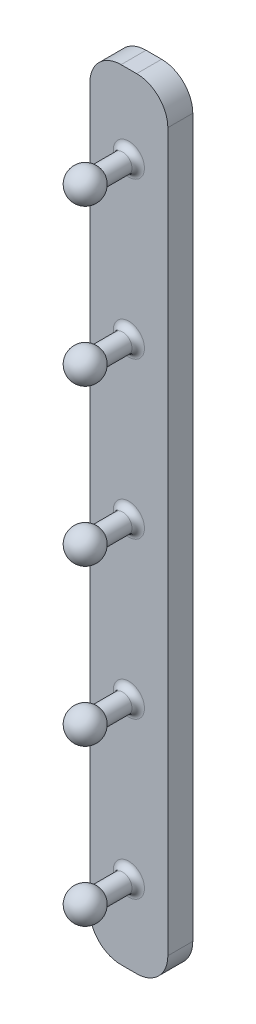
ISO-10303-21;
HEADER;
FILE_DESCRIPTION(('STEP AP214'),'2;1');
FILE_NAME('part.step','',(''),(''),'','','');
FILE_SCHEMA(('AUTOMOTIVE_DESIGN { 1 0 10303 214 1 1 1 1 }'));
ENDSEC;
DATA;
#1=APPLICATION_CONTEXT('core data for automotive mechanical design processes');
#2=APPLICATION_PROTOCOL_DEFINITION('international standard','automotive_design',2000,#1);
#3=PRODUCT_CONTEXT('',#1,'mechanical');
#4=PRODUCT('Part','Part','',(#3));
#5=PRODUCT_RELATED_PRODUCT_CATEGORY('part','',(#4));
#6=PRODUCT_DEFINITION_FORMATION('','',#4);
#7=PRODUCT_DEFINITION_CONTEXT('part definition',#1,'design');
#8=PRODUCT_DEFINITION('design','',#6,#7);
#9=PRODUCT_DEFINITION_SHAPE('','',#8);
#10=(LENGTH_UNIT() NAMED_UNIT(*) SI_UNIT(.MILLI.,.METRE.));
#11=(NAMED_UNIT(*) PLANE_ANGLE_UNIT() SI_UNIT($,.RADIAN.));
#12=(NAMED_UNIT(*) SI_UNIT($,.STERADIAN.) SOLID_ANGLE_UNIT());
#13=UNCERTAINTY_MEASURE_WITH_UNIT(LENGTH_MEASURE(1.E-05),#10,'distance_accuracy_value','');
#14=(GEOMETRIC_REPRESENTATION_CONTEXT(3) GLOBAL_UNCERTAINTY_ASSIGNED_CONTEXT((#13)) GLOBAL_UNIT_ASSIGNED_CONTEXT((#10,
#11,#12)) REPRESENTATION_CONTEXT('',''));
#15=CARTESIAN_POINT('',(0.,0.,0.));
#16=DIRECTION('',(0.,0.,1.));
#17=DIRECTION('',(1.,0.,0.));
#18=AXIS2_PLACEMENT_3D('',#15,#16,#17);
#19=CARTESIAN_POINT('',(2.5,-115.,8.));
#20=DIRECTION('',(0.,0.,-1.));
#21=DIRECTION('',(-1.,0.,0.));
#22=AXIS2_PLACEMENT_3D('',#19,#20,#21);
#23=CYLINDRICAL_SURFACE('',#22,10.);
#24=CARTESIAN_POINT('',(2.5,-115.,0.));
#25=DIRECTION('',(0.,0.,1.));
#26=DIRECTION('',(1.,0.,0.));
#27=AXIS2_PLACEMENT_3D('',#24,#25,#26);
#28=CIRCLE('',#27,10.);
#29=CARTESIAN_POINT('',(2.5,-125.,0.));
#30=VERTEX_POINT('',#29);
#31=CARTESIAN_POINT('',(12.5,-115.,0.));
#32=VERTEX_POINT('',#31);
#33=EDGE_CURVE('E139',#30,#32,#28,.T.);
#34=ORIENTED_EDGE('',*,*,#33,.T.);
#35=DIRECTION('',(0.,0.,-1.));
#36=VECTOR('',#35,1.);
#37=CARTESIAN_POINT('',(12.5,-115.,8.));
#38=LINE('',#37,#36);
#39=CARTESIAN_POINT('',(12.5,-115.,8.));
#40=VERTEX_POINT('',#39);
#41=EDGE_CURVE('E167',#40,#32,#38,.T.);
#42=ORIENTED_EDGE('',*,*,#41,.F.);
#43=CARTESIAN_POINT('',(2.5,-115.,8.));
#44=DIRECTION('',(0.,0.,1.));
#45=DIRECTION('',(1.,0.,0.));
#46=AXIS2_PLACEMENT_3D('',#43,#44,#45);
#47=CIRCLE('',#46,10.);
#48=CARTESIAN_POINT('',(2.5,-125.,8.));
#49=VERTEX_POINT('',#48);
#50=EDGE_CURVE('E154',#49,#40,#47,.T.);
#51=ORIENTED_EDGE('',*,*,#50,.F.);
#52=DIRECTION('',(0.,0.,-1.));
#53=VECTOR('',#52,1.);
#54=CARTESIAN_POINT('',(2.5,-125.,8.));
#55=LINE('',#54,#53);
#56=EDGE_CURVE('E135',#49,#30,#55,.T.);
#57=ORIENTED_EDGE('',*,*,#56,.T.);
#58=EDGE_LOOP('',(#34,#42,#51,#57));
#59=FACE_BOUND('',#58,.T.);
#60=ADVANCED_FACE('F41',(#59),#23,.T.);
#61=CARTESIAN_POINT('',(12.5,-115.,8.));
#62=DIRECTION('',(-1.,0.,0.));
#63=DIRECTION('',(0.,-1.,0.));
#64=AXIS2_PLACEMENT_3D('',#61,#62,#63);
#65=PLANE('',#64);
#66=DIRECTION('',(0.,1.,0.));
#67=VECTOR('',#66,1.);
#68=CARTESIAN_POINT('',(12.5,-115.,0.));
#69=LINE('',#68,#67);
#70=CARTESIAN_POINT('',(12.5,115.,0.));
#71=VERTEX_POINT('',#70);
#72=EDGE_CURVE('E142',#32,#71,#69,.T.);
#73=ORIENTED_EDGE('',*,*,#72,.T.);
#74=DIRECTION('',(0.,0.,-1.));
#75=VECTOR('',#74,1.);
#76=CARTESIAN_POINT('',(12.5,115.,8.));
#77=LINE('',#76,#75);
#78=CARTESIAN_POINT('',(12.5,115.,8.));
#79=VERTEX_POINT('',#78);
#80=EDGE_CURVE('E164',#79,#71,#77,.T.);
#81=ORIENTED_EDGE('',*,*,#80,.F.);
#82=DIRECTION('',(0.,1.,0.));
#83=VECTOR('',#82,1.);
#84=CARTESIAN_POINT('',(12.5,-115.,8.));
#85=LINE('',#84,#83);
#86=EDGE_CURVE('E102',#40,#79,#85,.T.);
#87=ORIENTED_EDGE('',*,*,#86,.F.);
#88=ORIENTED_EDGE('',*,*,#41,.T.);
#89=EDGE_LOOP('',(#73,#81,#87,#88));
#90=FACE_BOUND('',#89,.T.);
#91=ADVANCED_FACE('F208',(#90),#65,.F.);
#92=CARTESIAN_POINT('',(2.5,115.,8.));
#93=DIRECTION('',(0.,0.,-1.));
#94=DIRECTION('',(-1.,0.,0.));
#95=AXIS2_PLACEMENT_3D('',#92,#93,#94);
#96=CYLINDRICAL_SURFACE('',#95,9.99999999999998);
#97=CARTESIAN_POINT('',(2.5,115.,0.));
#98=DIRECTION('',(0.,0.,1.));
#99=DIRECTION('',(1.,0.,0.));
#100=AXIS2_PLACEMENT_3D('',#97,#98,#99);
#101=CIRCLE('',#100,9.99999999999998);
#102=CARTESIAN_POINT('',(2.5,125.,0.));
#103=VERTEX_POINT('',#102);
#104=EDGE_CURVE('E145',#71,#103,#101,.T.);
#105=ORIENTED_EDGE('',*,*,#104,.T.);
#106=DIRECTION('',(0.,0.,-1.));
#107=VECTOR('',#106,1.);
#108=CARTESIAN_POINT('',(2.5,125.,8.));
#109=LINE('',#108,#107);
#110=CARTESIAN_POINT('',(2.5,125.,8.));
#111=VERTEX_POINT('',#110);
#112=EDGE_CURVE('E161',#111,#103,#109,.T.);
#113=ORIENTED_EDGE('',*,*,#112,.F.);
#114=CARTESIAN_POINT('',(2.5,115.,8.));
#115=DIRECTION('',(0.,0.,1.));
#116=DIRECTION('',(1.,0.,0.));
#117=AXIS2_PLACEMENT_3D('',#114,#115,#116);
#118=CIRCLE('',#117,9.99999999999998);
#119=EDGE_CURVE('E261',#79,#111,#118,.T.);
#120=ORIENTED_EDGE('',*,*,#119,.F.);
#121=ORIENTED_EDGE('',*,*,#80,.T.);
#122=EDGE_LOOP('',(#105,#113,#120,#121));
#123=FACE_BOUND('',#122,.T.);
#124=ADVANCED_FACE('F214',(#123),#96,.T.);
#125=CARTESIAN_POINT('',(-2.50000000000001,125.,8.));
#126=DIRECTION('',(0.,-1.,0.));
#127=DIRECTION('',(0.,0.,-1.));
#128=AXIS2_PLACEMENT_3D('',#125,#126,#127);
#129=PLANE('',#128);
#130=DIRECTION('',(-1.,0.,0.));
#131=VECTOR('',#130,1.);
#132=CARTESIAN_POINT('',(-2.50000000000001,125.,0.));
#133=LINE('',#132,#131);
#134=CARTESIAN_POINT('',(-2.5,125.,0.));
#135=VERTEX_POINT('',#134);
#136=EDGE_CURVE('E147',#103,#135,#133,.T.);
#137=ORIENTED_EDGE('',*,*,#136,.T.);
#138=DIRECTION('',(0.,0.,-1.));
#139=VECTOR('',#138,1.);
#140=CARTESIAN_POINT('',(-2.5,125.,8.));
#141=LINE('',#140,#139);
#142=CARTESIAN_POINT('',(-2.5,125.,8.));
#143=VERTEX_POINT('',#142);
#144=EDGE_CURVE('E158',#143,#135,#141,.T.);
#145=ORIENTED_EDGE('',*,*,#144,.F.);
#146=DIRECTION('',(-1.,0.,0.));
#147=VECTOR('',#146,1.);
#148=CARTESIAN_POINT('',(-2.50000000000001,125.,8.));
#149=LINE('',#148,#147);
#150=EDGE_CURVE('E263',#111,#143,#149,.T.);
#151=ORIENTED_EDGE('',*,*,#150,.F.);
#152=ORIENTED_EDGE('',*,*,#112,.T.);
#153=EDGE_LOOP('',(#137,#145,#151,#152));
#154=FACE_BOUND('',#153,.T.);
#155=ADVANCED_FACE('F269',(#154),#129,.F.);
#156=CARTESIAN_POINT('',(-2.5,115.,8.));
#157=DIRECTION('',(0.,0.,-1.));
#158=DIRECTION('',(-1.,0.,0.));
#159=AXIS2_PLACEMENT_3D('',#156,#157,#158);
#160=CYLINDRICAL_SURFACE('',#159,9.99999999999998);
#161=CARTESIAN_POINT('',(-2.5,115.,0.));
#162=DIRECTION('',(0.,0.,1.));
#163=DIRECTION('',(-1.,0.,0.));
#164=AXIS2_PLACEMENT_3D('',#161,#162,#163);
#165=CIRCLE('',#164,9.99999999999998);
#166=CARTESIAN_POINT('',(-12.5,115.,0.));
#167=VERTEX_POINT('',#166);
#168=EDGE_CURVE('E149',#135,#167,#165,.T.);
#169=ORIENTED_EDGE('',*,*,#168,.T.);
#170=DIRECTION('',(0.,0.,-1.));
#171=VECTOR('',#170,1.);
#172=CARTESIAN_POINT('',(-12.5,115.,8.));
#173=LINE('',#172,#171);
#174=CARTESIAN_POINT('',(-12.5,115.,8.));
#175=VERTEX_POINT('',#174);
#176=EDGE_CURVE('E130',#175,#167,#173,.T.);
#177=ORIENTED_EDGE('',*,*,#176,.F.);
#178=CARTESIAN_POINT('',(-2.5,115.,8.));
#179=DIRECTION('',(0.,0.,1.));
#180=DIRECTION('',(-1.,0.,0.));
#181=AXIS2_PLACEMENT_3D('',#178,#179,#180);
#182=CIRCLE('',#181,9.99999999999998);
#183=EDGE_CURVE('E121',#143,#175,#182,.T.);
#184=ORIENTED_EDGE('',*,*,#183,.F.);
#185=ORIENTED_EDGE('',*,*,#144,.T.);
#186=EDGE_LOOP('',(#169,#177,#184,#185));
#187=FACE_BOUND('',#186,.T.);
#188=ADVANCED_FACE('F273',(#187),#160,.T.);
#189=CARTESIAN_POINT('',(-12.5,-115.,8.));
#190=DIRECTION('',(1.,0.,0.));
#191=DIRECTION('',(0.,1.,0.));
#192=AXIS2_PLACEMENT_3D('',#189,#190,#191);
#193=PLANE('',#192);
#194=DIRECTION('',(0.,-1.,0.));
#195=VECTOR('',#194,1.);
#196=CARTESIAN_POINT('',(-12.5,-115.,0.));
#197=LINE('',#196,#195);
#198=CARTESIAN_POINT('',(-12.5,-115.,0.));
#199=VERTEX_POINT('',#198);
#200=EDGE_CURVE('E129',#167,#199,#197,.T.);
#201=ORIENTED_EDGE('',*,*,#200,.T.);
#202=DIRECTION('',(0.,0.,-1.));
#203=VECTOR('',#202,1.);
#204=CARTESIAN_POINT('',(-12.5,-115.,8.));
#205=LINE('',#204,#203);
#206=CARTESIAN_POINT('',(-12.5,-115.,8.));
#207=VERTEX_POINT('',#206);
#208=EDGE_CURVE('E126',#207,#199,#205,.T.);
#209=ORIENTED_EDGE('',*,*,#208,.F.);
#210=DIRECTION('',(0.,-1.,0.));
#211=VECTOR('',#210,1.);
#212=CARTESIAN_POINT('',(-12.5,-115.,8.));
#213=LINE('',#212,#211);
#214=EDGE_CURVE('E115',#175,#207,#213,.T.);
#215=ORIENTED_EDGE('',*,*,#214,.F.);
#216=ORIENTED_EDGE('',*,*,#176,.T.);
#217=EDGE_LOOP('',(#201,#209,#215,#216));
#218=FACE_BOUND('',#217,.T.);
#219=ADVANCED_FACE('F127',(#218),#193,.F.);
#220=CARTESIAN_POINT('',(-2.5,-115.,8.));
#221=DIRECTION('',(0.,0.,-1.));
#222=DIRECTION('',(-1.,0.,0.));
#223=AXIS2_PLACEMENT_3D('',#220,#221,#222);
#224=CYLINDRICAL_SURFACE('',#223,10.);
#225=CARTESIAN_POINT('',(-2.5,-115.,0.));
#226=DIRECTION('',(0.,0.,1.));
#227=DIRECTION('',(1.,0.,0.));
#228=AXIS2_PLACEMENT_3D('',#225,#226,#227);
#229=CIRCLE('',#228,10.);
#230=CARTESIAN_POINT('',(-2.5,-125.,0.));
#231=VERTEX_POINT('',#230);
#232=EDGE_CURVE('E87',#199,#231,#229,.T.);
#233=ORIENTED_EDGE('',*,*,#232,.T.);
#234=DIRECTION('',(0.,0.,-1.));
#235=VECTOR('',#234,1.);
#236=CARTESIAN_POINT('',(-2.5,-125.,8.));
#237=LINE('',#236,#235);
#238=CARTESIAN_POINT('',(-2.5,-125.,8.));
#239=VERTEX_POINT('',#238);
#240=EDGE_CURVE('E131',#239,#231,#237,.T.);
#241=ORIENTED_EDGE('',*,*,#240,.F.);
#242=CARTESIAN_POINT('',(-2.5,-115.,8.));
#243=DIRECTION('',(0.,0.,1.));
#244=DIRECTION('',(1.,0.,0.));
#245=AXIS2_PLACEMENT_3D('',#242,#243,#244);
#246=CIRCLE('',#245,10.);
#247=EDGE_CURVE('E119',#207,#239,#246,.T.);
#248=ORIENTED_EDGE('',*,*,#247,.F.);
#249=ORIENTED_EDGE('',*,*,#208,.T.);
#250=EDGE_LOOP('',(#233,#241,#248,#249));
#251=FACE_BOUND('',#250,.T.);
#252=ADVANCED_FACE('F133',(#251),#224,.T.);
#253=CARTESIAN_POINT('',(-2.5,-125.,8.));
#254=DIRECTION('',(0.,1.,0.));
#255=DIRECTION('',(0.,0.,1.));
#256=AXIS2_PLACEMENT_3D('',#253,#254,#255);
#257=PLANE('',#256);
#258=DIRECTION('',(1.,0.,0.));
#259=VECTOR('',#258,1.);
#260=CARTESIAN_POINT('',(-2.5,-125.,0.));
#261=LINE('',#260,#259);
#262=EDGE_CURVE('E93',#231,#30,#261,.T.);
#263=ORIENTED_EDGE('',*,*,#262,.T.);
#264=ORIENTED_EDGE('',*,*,#56,.F.);
#265=DIRECTION('',(1.,0.,0.));
#266=VECTOR('',#265,1.);
#267=CARTESIAN_POINT('',(-2.5,-125.,8.));
#268=LINE('',#267,#266);
#269=EDGE_CURVE('E58',#239,#49,#268,.T.);
#270=ORIENTED_EDGE('',*,*,#269,.F.);
#271=ORIENTED_EDGE('',*,*,#240,.T.);
#272=EDGE_LOOP('',(#263,#264,#270,#271));
#273=FACE_BOUND('',#272,.T.);
#274=ADVANCED_FACE('F280',(#273),#257,.F.);
#275=CARTESIAN_POINT('',(2.5,-115.,8.));
#276=DIRECTION('',(0.,0.,1.));
#277=DIRECTION('',(1.,0.,0.));
#278=AXIS2_PLACEMENT_3D('',#275,#276,#277);
#279=PLANE('',#278);
#280=CARTESIAN_POINT('',(0.,100.,8.));
#281=DIRECTION('',(0.,0.,1.));
#282=DIRECTION('',(1.,0.,0.));
#283=AXIS2_PLACEMENT_3D('',#280,#281,#282);
#284=CIRCLE('',#283,5.);
#285=CARTESIAN_POINT('',(5.,100.,8.));
#286=VERTEX_POINT('',#285);
#287=EDGE_CURVE('E11',#286,#286,#284,.F.);
#288=ORIENTED_EDGE('',*,*,#287,.T.);
#289=EDGE_LOOP('',(#288));
#290=FACE_BOUND('',#289,.T.);
#291=CARTESIAN_POINT('',(0.,50.,8.));
#292=DIRECTION('',(0.,0.,1.));
#293=DIRECTION('',(1.,0.,0.));
#294=AXIS2_PLACEMENT_3D('',#291,#292,#293);
#295=CIRCLE('',#294,5.);
#296=CARTESIAN_POINT('',(5.,50.,8.));
#297=VERTEX_POINT('',#296);
#298=EDGE_CURVE('E190',#297,#297,#295,.F.);
#299=ORIENTED_EDGE('',*,*,#298,.T.);
#300=EDGE_LOOP('',(#299));
#301=FACE_BOUND('',#300,.T.);
#302=CARTESIAN_POINT('',(0.,-100.,8.));
#303=DIRECTION('',(0.,0.,1.));
#304=DIRECTION('',(1.,0.,0.));
#305=AXIS2_PLACEMENT_3D('',#302,#303,#304);
#306=CIRCLE('',#305,5.);
#307=CARTESIAN_POINT('',(5.,-100.,8.));
#308=VERTEX_POINT('',#307);
#309=EDGE_CURVE('E184',#308,#308,#306,.F.);
#310=ORIENTED_EDGE('',*,*,#309,.T.);
#311=EDGE_LOOP('',(#310));
#312=FACE_BOUND('',#311,.T.);
#313=CARTESIAN_POINT('',(0.,-50.,8.));
#314=DIRECTION('',(0.,0.,1.));
#315=DIRECTION('',(1.,0.,0.));
#316=AXIS2_PLACEMENT_3D('',#313,#314,#315);
#317=CIRCLE('',#316,5.);
#318=CARTESIAN_POINT('',(5.,-50.,8.));
#319=VERTEX_POINT('',#318);
#320=EDGE_CURVE('E178',#319,#319,#317,.F.);
#321=ORIENTED_EDGE('',*,*,#320,.T.);
#322=EDGE_LOOP('',(#321));
#323=FACE_BOUND('',#322,.T.);
#324=CARTESIAN_POINT('',(0.,0.,8.));
#325=DIRECTION('',(0.,0.,1.));
#326=DIRECTION('',(1.,0.,0.));
#327=AXIS2_PLACEMENT_3D('',#324,#325,#326);
#328=CIRCLE('',#327,5.);
#329=CARTESIAN_POINT('',(5.,0.,8.));
#330=VERTEX_POINT('',#329);
#331=EDGE_CURVE('E172',#330,#330,#328,.F.);
#332=ORIENTED_EDGE('',*,*,#331,.T.);
#333=EDGE_LOOP('',(#332));
#334=FACE_BOUND('',#333,.T.);
#335=ORIENTED_EDGE('',*,*,#50,.T.);
#336=ORIENTED_EDGE('',*,*,#86,.T.);
#337=ORIENTED_EDGE('',*,*,#119,.T.);
#338=ORIENTED_EDGE('',*,*,#150,.T.);
#339=ORIENTED_EDGE('',*,*,#183,.T.);
#340=ORIENTED_EDGE('',*,*,#214,.T.);
#341=ORIENTED_EDGE('',*,*,#247,.T.);
#342=ORIENTED_EDGE('',*,*,#269,.T.);
#343=EDGE_LOOP('',(#335,#336,#337,#338,#339,#340,#341,#342));
#344=FACE_BOUND('',#343,.T.);
#345=ADVANCED_FACE('F117',(#290,#301,#312,#323,#334,#344),#279,.T.);
#346=CARTESIAN_POINT('',(2.5,-115.,0.));
#347=DIRECTION('',(0.,0.,1.));
#348=DIRECTION('',(1.,0.,0.));
#349=AXIS2_PLACEMENT_3D('',#346,#347,#348);
#350=PLANE('',#349);
#351=ORIENTED_EDGE('',*,*,#33,.F.);
#352=ORIENTED_EDGE('',*,*,#262,.F.);
#353=ORIENTED_EDGE('',*,*,#232,.F.);
#354=ORIENTED_EDGE('',*,*,#200,.F.);
#355=ORIENTED_EDGE('',*,*,#168,.F.);
#356=ORIENTED_EDGE('',*,*,#136,.F.);
#357=ORIENTED_EDGE('',*,*,#104,.F.);
#358=ORIENTED_EDGE('',*,*,#72,.F.);
#359=EDGE_LOOP('',(#351,#352,#353,#354,#355,#356,#357,#358));
#360=FACE_BOUND('',#359,.T.);
#361=ADVANCED_FACE('F276',(#360),#350,.F.);
#362=CARTESIAN_POINT('',(0.,0.,18.));
#363=DIRECTION('',(0.,0.,-1.));
#364=DIRECTION('',(-1.,0.,0.));
#365=AXIS2_PLACEMENT_3D('',#362,#363,#364);
#366=CYLINDRICAL_SURFACE('',#365,3.);
#367=CARTESIAN_POINT('',(0.,0.,10.));
#368=DIRECTION('',(0.,0.,1.));
#369=DIRECTION('',(1.,0.,0.));
#370=AXIS2_PLACEMENT_3D('',#367,#368,#369);
#371=CIRCLE('',#370,3.);
#372=CARTESIAN_POINT('',(3.,0.,10.));
#373=VERTEX_POINT('',#372);
#374=EDGE_CURVE('E169',#373,#373,#371,.T.);
#375=ORIENTED_EDGE('',*,*,#374,.T.);
#376=EDGE_LOOP('',(#375));
#377=FACE_BOUND('',#376,.T.);
#378=CARTESIAN_POINT('',(0.,0.,18.));
#379=DIRECTION('',(0.,0.,1.));
#380=DIRECTION('',(1.,0.,0.));
#381=AXIS2_PLACEMENT_3D('',#378,#379,#380);
#382=CIRCLE('',#381,3.);
#383=CARTESIAN_POINT('',(3.,0.,18.));
#384=VERTEX_POINT('',#383);
#385=EDGE_CURVE('E143',#384,#384,#382,.T.);
#386=ORIENTED_EDGE('',*,*,#385,.F.);
#387=EDGE_LOOP('',(#386));
#388=FACE_BOUND('',#387,.T.);
#389=ADVANCED_FACE('F344',(#377,#388),#366,.T.);
#390=CARTESIAN_POINT('',(0.,0.,22.));
#391=DIRECTION('',(0.,0.,-1.));
#392=DIRECTION('',(0.,1.,0.));
#393=AXIS2_PLACEMENT_3D('',#390,#391,#392);
#394=SPHERICAL_SURFACE('',#393,5.);
#395=ORIENTED_EDGE('',*,*,#385,.T.);
#396=EDGE_LOOP('',(#395));
#397=FACE_BOUND('',#396,.T.);
#398=ADVANCED_FACE('F222',(#397),#394,.T.);
#399=CARTESIAN_POINT('',(0.,0.,10.));
#400=DIRECTION('',(0.,0.,1.));
#401=DIRECTION('',(1.,0.,0.));
#402=AXIS2_PLACEMENT_3D('',#399,#400,#401);
#403=TOROIDAL_SURFACE('',#402,5.,2.);
#404=ORIENTED_EDGE('',*,*,#331,.F.);
#405=EDGE_LOOP('',(#404));
#406=FACE_BOUND('',#405,.T.);
#407=ORIENTED_EDGE('',*,*,#374,.F.);
#408=EDGE_LOOP('',(#407));
#409=FACE_BOUND('',#408,.T.);
#410=ADVANCED_FACE('F218',(#406,#409),#403,.F.);
#411=CARTESIAN_POINT('',(0.,-50.,18.));
#412=DIRECTION('',(0.,0.,-1.));
#413=DIRECTION('',(-1.,0.,0.));
#414=AXIS2_PLACEMENT_3D('',#411,#412,#413);
#415=CYLINDRICAL_SURFACE('',#414,3.);
#416=CARTESIAN_POINT('',(0.,-50.,10.));
#417=DIRECTION('',(0.,0.,1.));
#418=DIRECTION('',(1.,0.,0.));
#419=AXIS2_PLACEMENT_3D('',#416,#417,#418);
#420=CIRCLE('',#419,3.);
#421=CARTESIAN_POINT('',(3.,-50.,10.));
#422=VERTEX_POINT('',#421);
#423=EDGE_CURVE('E175',#422,#422,#420,.T.);
#424=ORIENTED_EDGE('',*,*,#423,.T.);
#425=EDGE_LOOP('',(#424));
#426=FACE_BOUND('',#425,.T.);
#427=CARTESIAN_POINT('',(0.,-50.,18.));
#428=DIRECTION('',(0.,0.,1.));
#429=DIRECTION('',(1.,0.,0.));
#430=AXIS2_PLACEMENT_3D('',#427,#428,#429);
#431=CIRCLE('',#430,3.);
#432=CARTESIAN_POINT('',(3.,-50.,18.));
#433=VERTEX_POINT('',#432);
#434=EDGE_CURVE('E246',#433,#433,#431,.T.);
#435=ORIENTED_EDGE('',*,*,#434,.F.);
#436=EDGE_LOOP('',(#435));
#437=FACE_BOUND('',#436,.T.);
#438=ADVANCED_FACE('F221',(#426,#437),#415,.T.);
#439=CARTESIAN_POINT('',(0.,-100.,18.));
#440=DIRECTION('',(0.,0.,-1.));
#441=DIRECTION('',(-1.,0.,0.));
#442=AXIS2_PLACEMENT_3D('',#439,#440,#441);
#443=CYLINDRICAL_SURFACE('',#442,3.);
#444=CARTESIAN_POINT('',(0.,-100.,10.));
#445=DIRECTION('',(0.,0.,1.));
#446=DIRECTION('',(1.,0.,0.));
#447=AXIS2_PLACEMENT_3D('',#444,#445,#446);
#448=CIRCLE('',#447,3.);
#449=CARTESIAN_POINT('',(3.,-100.,10.));
#450=VERTEX_POINT('',#449);
#451=EDGE_CURVE('E181',#450,#450,#448,.T.);
#452=ORIENTED_EDGE('',*,*,#451,.T.);
#453=EDGE_LOOP('',(#452));
#454=FACE_BOUND('',#453,.T.);
#455=CARTESIAN_POINT('',(0.,-100.,18.));
#456=DIRECTION('',(0.,0.,1.));
#457=DIRECTION('',(1.,0.,0.));
#458=AXIS2_PLACEMENT_3D('',#455,#456,#457);
#459=CIRCLE('',#458,3.);
#460=CARTESIAN_POINT('',(3.,-100.,18.));
#461=VERTEX_POINT('',#460);
#462=EDGE_CURVE('E244',#461,#461,#459,.T.);
#463=ORIENTED_EDGE('',*,*,#462,.F.);
#464=EDGE_LOOP('',(#463));
#465=FACE_BOUND('',#464,.T.);
#466=ADVANCED_FACE('F237',(#454,#465),#443,.T.);
#467=CARTESIAN_POINT('',(0.,50.,18.));
#468=DIRECTION('',(0.,0.,-1.));
#469=DIRECTION('',(-1.,0.,0.));
#470=AXIS2_PLACEMENT_3D('',#467,#468,#469);
#471=CYLINDRICAL_SURFACE('',#470,3.);
#472=CARTESIAN_POINT('',(0.,50.,10.));
#473=DIRECTION('',(0.,0.,1.));
#474=DIRECTION('',(1.,0.,0.));
#475=AXIS2_PLACEMENT_3D('',#472,#473,#474);
#476=CIRCLE('',#475,3.);
#477=CARTESIAN_POINT('',(3.,50.,10.));
#478=VERTEX_POINT('',#477);
#479=EDGE_CURVE('E187',#478,#478,#476,.T.);
#480=ORIENTED_EDGE('',*,*,#479,.T.);
#481=EDGE_LOOP('',(#480));
#482=FACE_BOUND('',#481,.T.);
#483=CARTESIAN_POINT('',(0.,50.,18.));
#484=DIRECTION('',(0.,0.,1.));
#485=DIRECTION('',(1.,0.,0.));
#486=AXIS2_PLACEMENT_3D('',#483,#484,#485);
#487=CIRCLE('',#486,3.);
#488=CARTESIAN_POINT('',(3.,50.,18.));
#489=VERTEX_POINT('',#488);
#490=EDGE_CURVE('E247',#489,#489,#487,.T.);
#491=ORIENTED_EDGE('',*,*,#490,.F.);
#492=EDGE_LOOP('',(#491));
#493=FACE_BOUND('',#492,.T.);
#494=ADVANCED_FACE('F240',(#482,#493),#471,.T.);
#495=CARTESIAN_POINT('',(0.,100.,18.));
#496=DIRECTION('',(0.,0.,-1.));
#497=DIRECTION('',(-1.,0.,0.));
#498=AXIS2_PLACEMENT_3D('',#495,#496,#497);
#499=CYLINDRICAL_SURFACE('',#498,3.);
#500=CARTESIAN_POINT('',(0.,100.,10.));
#501=DIRECTION('',(0.,0.,1.));
#502=DIRECTION('',(1.,0.,0.));
#503=AXIS2_PLACEMENT_3D('',#500,#501,#502);
#504=CIRCLE('',#503,3.);
#505=CARTESIAN_POINT('',(3.,100.,10.));
#506=VERTEX_POINT('',#505);
#507=EDGE_CURVE('E50',#506,#506,#504,.T.);
#508=ORIENTED_EDGE('',*,*,#507,.T.);
#509=EDGE_LOOP('',(#508));
#510=FACE_BOUND('',#509,.T.);
#511=CARTESIAN_POINT('',(0.,100.,18.));
#512=DIRECTION('',(0.,0.,1.));
#513=DIRECTION('',(1.,0.,0.));
#514=AXIS2_PLACEMENT_3D('',#511,#512,#513);
#515=CIRCLE('',#514,3.);
#516=CARTESIAN_POINT('',(3.,100.,18.));
#517=VERTEX_POINT('',#516);
#518=EDGE_CURVE('E252',#517,#517,#515,.T.);
#519=ORIENTED_EDGE('',*,*,#518,.F.);
#520=EDGE_LOOP('',(#519));
#521=FACE_BOUND('',#520,.T.);
#522=ADVANCED_FACE('F195',(#510,#521),#499,.T.);
#523=CARTESIAN_POINT('',(0.,-50.,22.));
#524=DIRECTION('',(0.,0.,-1.));
#525=DIRECTION('',(0.,1.,0.));
#526=AXIS2_PLACEMENT_3D('',#523,#524,#525);
#527=SPHERICAL_SURFACE('',#526,5.);
#528=ORIENTED_EDGE('',*,*,#434,.T.);
#529=EDGE_LOOP('',(#528));
#530=FACE_BOUND('',#529,.T.);
#531=ADVANCED_FACE('F399',(#530),#527,.T.);
#532=CARTESIAN_POINT('',(0.,-100.,22.));
#533=DIRECTION('',(0.,0.,-1.));
#534=DIRECTION('',(0.,1.,0.));
#535=AXIS2_PLACEMENT_3D('',#532,#533,#534);
#536=SPHERICAL_SURFACE('',#535,5.);
#537=ORIENTED_EDGE('',*,*,#462,.T.);
#538=EDGE_LOOP('',(#537));
#539=FACE_BOUND('',#538,.T.);
#540=ADVANCED_FACE('F408',(#539),#536,.T.);
#541=CARTESIAN_POINT('',(0.,50.,22.));
#542=DIRECTION('',(0.,0.,-1.));
#543=DIRECTION('',(0.,1.,0.));
#544=AXIS2_PLACEMENT_3D('',#541,#542,#543);
#545=SPHERICAL_SURFACE('',#544,5.);
#546=ORIENTED_EDGE('',*,*,#490,.T.);
#547=EDGE_LOOP('',(#546));
#548=FACE_BOUND('',#547,.T.);
#549=ADVANCED_FACE('F418',(#548),#545,.T.);
#550=CARTESIAN_POINT('',(0.,100.,22.));
#551=DIRECTION('',(0.,0.,-1.));
#552=DIRECTION('',(0.,1.,0.));
#553=AXIS2_PLACEMENT_3D('',#550,#551,#552);
#554=SPHERICAL_SURFACE('',#553,5.);
#555=ORIENTED_EDGE('',*,*,#518,.T.);
#556=EDGE_LOOP('',(#555));
#557=FACE_BOUND('',#556,.T.);
#558=ADVANCED_FACE('F227',(#557),#554,.T.);
#559=CARTESIAN_POINT('',(0.,-50.,10.));
#560=DIRECTION('',(0.,0.,1.));
#561=DIRECTION('',(1.,0.,0.));
#562=AXIS2_PLACEMENT_3D('',#559,#560,#561);
#563=TOROIDAL_SURFACE('',#562,5.,2.);
#564=ORIENTED_EDGE('',*,*,#320,.F.);
#565=EDGE_LOOP('',(#564));
#566=FACE_BOUND('',#565,.T.);
#567=ORIENTED_EDGE('',*,*,#423,.F.);
#568=EDGE_LOOP('',(#567));
#569=FACE_BOUND('',#568,.T.);
#570=ADVANCED_FACE('F224',(#566,#569),#563,.F.);
#571=CARTESIAN_POINT('',(0.,-100.,10.));
#572=DIRECTION('',(0.,0.,1.));
#573=DIRECTION('',(1.,0.,0.));
#574=AXIS2_PLACEMENT_3D('',#571,#572,#573);
#575=TOROIDAL_SURFACE('',#574,5.,2.);
#576=ORIENTED_EDGE('',*,*,#309,.F.);
#577=EDGE_LOOP('',(#576));
#578=FACE_BOUND('',#577,.T.);
#579=ORIENTED_EDGE('',*,*,#451,.F.);
#580=EDGE_LOOP('',(#579));
#581=FACE_BOUND('',#580,.T.);
#582=ADVANCED_FACE('F204',(#578,#581),#575,.F.);
#583=CARTESIAN_POINT('',(0.,50.,10.));
#584=DIRECTION('',(0.,0.,1.));
#585=DIRECTION('',(1.,0.,0.));
#586=AXIS2_PLACEMENT_3D('',#583,#584,#585);
#587=TOROIDAL_SURFACE('',#586,5.,2.);
#588=ORIENTED_EDGE('',*,*,#298,.F.);
#589=EDGE_LOOP('',(#588));
#590=FACE_BOUND('',#589,.T.);
#591=ORIENTED_EDGE('',*,*,#479,.F.);
#592=EDGE_LOOP('',(#591));
#593=FACE_BOUND('',#592,.T.);
#594=ADVANCED_FACE('F199',(#590,#593),#587,.F.);
#595=CARTESIAN_POINT('',(0.,100.,10.));
#596=DIRECTION('',(0.,0.,1.));
#597=DIRECTION('',(1.,0.,0.));
#598=AXIS2_PLACEMENT_3D('',#595,#596,#597);
#599=TOROIDAL_SURFACE('',#598,5.,2.);
#600=ORIENTED_EDGE('',*,*,#287,.F.);
#601=EDGE_LOOP('',(#600));
#602=FACE_BOUND('',#601,.T.);
#603=ORIENTED_EDGE('',*,*,#507,.F.);
#604=EDGE_LOOP('',(#603));
#605=FACE_BOUND('',#604,.T.);
#606=ADVANCED_FACE('F43',(#602,#605),#599,.F.);
#607=CLOSED_SHELL('',(#60,#91,#124,#155,#188,#219,#252,#274,#345,#361,#389,#398,#410,#438,#466,
#494,#522,#531,#540,#549,#558,#570,#582,#594,#606));
#608=MANIFOLD_SOLID_BREP('B2',#607);
#609=ADVANCED_BREP_SHAPE_REPRESENTATION('',(#18,#608),#14);
#610=SHAPE_DEFINITION_REPRESENTATION(#9,#609);
ENDSEC;
END-ISO-10303-21;
